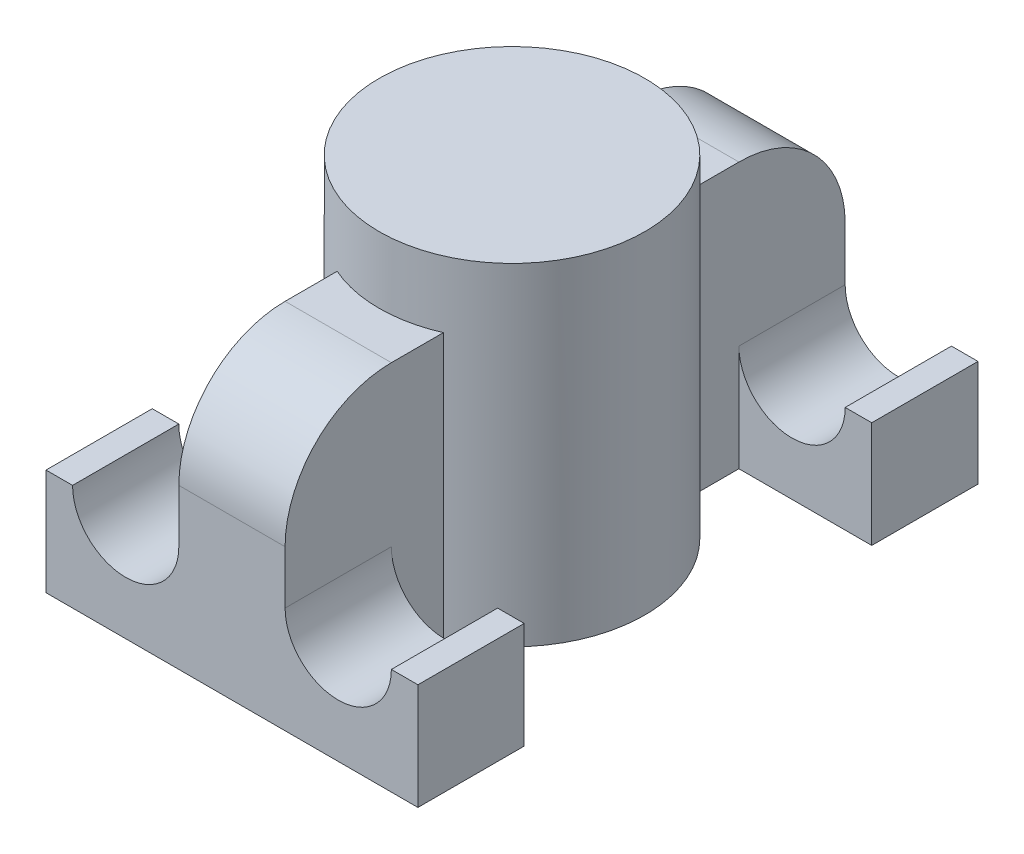
ISO-10303-21;
HEADER;
FILE_DESCRIPTION(('STEP AP214'),'2;1');
FILE_NAME('part.step','',(''),(''),'','','');
FILE_SCHEMA(('AUTOMOTIVE_DESIGN { 1 0 10303 214 1 1 1 1 }'));
ENDSEC;
DATA;
#1=APPLICATION_CONTEXT('core data for automotive mechanical design processes');
#2=APPLICATION_PROTOCOL_DEFINITION('international standard','automotive_design',2000,#1);
#3=PRODUCT_CONTEXT('',#1,'mechanical');
#4=PRODUCT('Part','Part','',(#3));
#5=PRODUCT_RELATED_PRODUCT_CATEGORY('part','',(#4));
#6=PRODUCT_DEFINITION_FORMATION('','',#4);
#7=PRODUCT_DEFINITION_CONTEXT('part definition',#1,'design');
#8=PRODUCT_DEFINITION('design','',#6,#7);
#9=PRODUCT_DEFINITION_SHAPE('','',#8);
#10=(LENGTH_UNIT() NAMED_UNIT(*) SI_UNIT(.MILLI.,.METRE.));
#11=(NAMED_UNIT(*) PLANE_ANGLE_UNIT() SI_UNIT($,.RADIAN.));
#12=(NAMED_UNIT(*) SI_UNIT($,.STERADIAN.) SOLID_ANGLE_UNIT());
#13=UNCERTAINTY_MEASURE_WITH_UNIT(LENGTH_MEASURE(1.E-05),#10,'distance_accuracy_value','');
#14=(GEOMETRIC_REPRESENTATION_CONTEXT(3) GLOBAL_UNCERTAINTY_ASSIGNED_CONTEXT((#13)) GLOBAL_UNIT_ASSIGNED_CONTEXT((#10,
#11,#12)) REPRESENTATION_CONTEXT('',''));
#15=CARTESIAN_POINT('',(0.,0.,0.));
#16=DIRECTION('',(0.,0.,1.));
#17=DIRECTION('',(1.,0.,0.));
#18=AXIS2_PLACEMENT_3D('',#15,#16,#17);
#19=CARTESIAN_POINT('',(-4.,20.,-21.0825756949558));
#20=DIRECTION('',(1.,0.,0.));
#21=DIRECTION('',(0.,0.,-1.));
#22=AXIS2_PLACEMENT_3D('',#19,#20,#21);
#23=PLANE('',#22);
#24=DIRECTION('',(0.,0.,1.));
#25=VECTOR('',#24,1.);
#26=CARTESIAN_POINT('',(-4.,20.,-21.0825756949558));
#27=LINE('',#26,#25);
#28=CARTESIAN_POINT('',(-4.,20.,-13.0825756949558));
#29=VERTEX_POINT('',#28);
#30=CARTESIAN_POINT('',(-4.,20.,-9.16515138991168));
#31=VERTEX_POINT('',#30);
#32=EDGE_CURVE('E381',#29,#31,#27,.T.);
#33=ORIENTED_EDGE('',*,*,#32,.F.);
#34=CARTESIAN_POINT('',(-4.,12.,-13.0825756949558));
#35=DIRECTION('',(1.,0.,0.));
#36=DIRECTION('',(0.,0.,-1.));
#37=AXIS2_PLACEMENT_3D('',#34,#35,#36);
#38=CIRCLE('',#37,8.);
#39=CARTESIAN_POINT('',(-4.,12.,-21.0825756949558));
#40=VERTEX_POINT('',#39);
#41=EDGE_CURVE('E404',#29,#40,#38,.F.);
#42=ORIENTED_EDGE('',*,*,#41,.T.);
#43=DIRECTION('',(0.,-1.,0.));
#44=VECTOR('',#43,1.);
#45=CARTESIAN_POINT('',(-4.,20.,-21.0825756949558));
#46=LINE('',#45,#44);
#47=CARTESIAN_POINT('',(-4.,8.,-21.0825756949558));
#48=VERTEX_POINT('',#47);
#49=EDGE_CURVE('E386',#40,#48,#46,.T.);
#50=ORIENTED_EDGE('',*,*,#49,.T.);
#51=DIRECTION('',(0.,0.,-1.));
#52=VECTOR('',#51,1.);
#53=CARTESIAN_POINT('',(-4.,8.,-13.0825756949558));
#54=LINE('',#53,#52);
#55=CARTESIAN_POINT('',(-4.,8.,-13.0825756949558));
#56=VERTEX_POINT('',#55);
#57=EDGE_CURVE('E228',#56,#48,#54,.T.);
#58=ORIENTED_EDGE('',*,*,#57,.F.);
#59=DIRECTION('',(0.,1.,0.));
#60=VECTOR('',#59,1.);
#61=CARTESIAN_POINT('',(-4.,8.,-13.0825756949558));
#62=LINE('',#61,#60);
#63=CARTESIAN_POINT('',(-4.,0.,-13.0825756949558));
#64=VERTEX_POINT('',#63);
#65=EDGE_CURVE('E225',#64,#56,#62,.T.);
#66=ORIENTED_EDGE('',*,*,#65,.F.);
#67=DIRECTION('',(0.,0.,1.));
#68=VECTOR('',#67,1.);
#69=CARTESIAN_POINT('',(-4.,0.,-21.0825756949558));
#70=LINE('',#69,#68);
#71=CARTESIAN_POINT('',(-4.,0.,-9.16515138991168));
#72=VERTEX_POINT('',#71);
#73=EDGE_CURVE('E209',#64,#72,#70,.T.);
#74=ORIENTED_EDGE('',*,*,#73,.T.);
#75=DIRECTION('',(0.,1.,0.));
#76=VECTOR('',#75,1.);
#77=CARTESIAN_POINT('',(-4.,0.,-9.16515138991168));
#78=LINE('',#77,#76);
#79=EDGE_CURVE('E379',#72,#31,#78,.T.);
#80=ORIENTED_EDGE('',*,*,#79,.T.);
#81=EDGE_LOOP('',(#33,#42,#50,#58,#66,#74,#80));
#82=FACE_BOUND('',#81,.T.);
#83=ADVANCED_FACE('F35',(#82),#23,.F.);
#84=CARTESIAN_POINT('',(4.,20.,-21.0825756949558));
#85=DIRECTION('',(-1.,0.,0.));
#86=DIRECTION('',(0.,0.,1.));
#87=AXIS2_PLACEMENT_3D('',#84,#85,#86);
#88=PLANE('',#87);
#89=DIRECTION('',(0.,-1.,0.));
#90=VECTOR('',#89,1.);
#91=CARTESIAN_POINT('',(4.,20.,-21.0825756949558));
#92=LINE('',#91,#90);
#93=CARTESIAN_POINT('',(4.,12.,-21.0825756949558));
#94=VERTEX_POINT('',#93);
#95=CARTESIAN_POINT('',(4.,8.,-21.0825756949558));
#96=VERTEX_POINT('',#95);
#97=EDGE_CURVE('E395',#94,#96,#92,.T.);
#98=ORIENTED_EDGE('',*,*,#97,.F.);
#99=CARTESIAN_POINT('',(4.,12.,-13.0825756949558));
#100=DIRECTION('',(-1.,0.,0.));
#101=DIRECTION('',(0.,0.,1.));
#102=AXIS2_PLACEMENT_3D('',#99,#100,#101);
#103=CIRCLE('',#102,8.);
#104=CARTESIAN_POINT('',(4.,20.,-13.0825756949558));
#105=VERTEX_POINT('',#104);
#106=EDGE_CURVE('E408',#94,#105,#103,.F.);
#107=ORIENTED_EDGE('',*,*,#106,.T.);
#108=DIRECTION('',(0.,0.,-1.));
#109=VECTOR('',#108,1.);
#110=CARTESIAN_POINT('',(4.,20.,-21.0825756949558));
#111=LINE('',#110,#109);
#112=CARTESIAN_POINT('',(4.,20.,-9.16515138991168));
#113=VERTEX_POINT('',#112);
#114=EDGE_CURVE('E383',#113,#105,#111,.T.);
#115=ORIENTED_EDGE('',*,*,#114,.F.);
#116=DIRECTION('',(0.,1.,0.));
#117=VECTOR('',#116,1.);
#118=CARTESIAN_POINT('',(4.,0.,-9.16515138991168));
#119=LINE('',#118,#117);
#120=CARTESIAN_POINT('',(4.,0.,-9.16515138991168));
#121=VERTEX_POINT('',#120);
#122=EDGE_CURVE('E377',#113,#121,#119,.F.);
#123=ORIENTED_EDGE('',*,*,#122,.T.);
#124=DIRECTION('',(0.,0.,-1.));
#125=VECTOR('',#124,1.);
#126=CARTESIAN_POINT('',(4.,0.,-21.0825756949558));
#127=LINE('',#126,#125);
#128=CARTESIAN_POINT('',(4.,0.,-13.0825756949558));
#129=VERTEX_POINT('',#128);
#130=EDGE_CURVE('E389',#121,#129,#127,.T.);
#131=ORIENTED_EDGE('',*,*,#130,.T.);
#132=DIRECTION('',(0.,1.,0.));
#133=VECTOR('',#132,1.);
#134=CARTESIAN_POINT('',(4.,8.,-13.0825756949558));
#135=LINE('',#134,#133);
#136=CARTESIAN_POINT('',(4.,8.,-13.0825756949558));
#137=VERTEX_POINT('',#136);
#138=EDGE_CURVE('E260',#129,#137,#135,.T.);
#139=ORIENTED_EDGE('',*,*,#138,.T.);
#140=DIRECTION('',(0.,0.,-1.));
#141=VECTOR('',#140,1.);
#142=CARTESIAN_POINT('',(4.,8.,-13.0825756949558));
#143=LINE('',#142,#141);
#144=EDGE_CURVE('E275',#137,#96,#143,.T.);
#145=ORIENTED_EDGE('',*,*,#144,.T.);
#146=EDGE_LOOP('',(#98,#107,#115,#123,#131,#139,#145));
#147=FACE_BOUND('',#146,.T.);
#148=ADVANCED_FACE('F436',(#147),#88,.F.);
#149=CARTESIAN_POINT('',(4.,20.,13.0825756949558));
#150=VERTEX_POINT('',#149);
#151=CARTESIAN_POINT('',(4.,20.,9.16515138991168));
#152=VERTEX_POINT('',#151);
#153=EDGE_CURVE('E385',#150,#152,#111,.T.);
#154=ORIENTED_EDGE('',*,*,#153,.F.);
#155=CARTESIAN_POINT('',(4.,12.,13.0825756949558));
#156=DIRECTION('',(-1.,0.,0.));
#157=DIRECTION('',(0.,0.,1.));
#158=AXIS2_PLACEMENT_3D('',#155,#156,#157);
#159=CIRCLE('',#158,8.);
#160=CARTESIAN_POINT('',(4.,12.,21.0825756949558));
#161=VERTEX_POINT('',#160);
#162=EDGE_CURVE('E57',#150,#161,#159,.F.);
#163=ORIENTED_EDGE('',*,*,#162,.T.);
#164=DIRECTION('',(0.,-1.,0.));
#165=VECTOR('',#164,1.);
#166=CARTESIAN_POINT('',(4.,20.,21.0825756949558));
#167=LINE('',#166,#165);
#168=CARTESIAN_POINT('',(4.,8.,21.0825756949558));
#169=VERTEX_POINT('',#168);
#170=EDGE_CURVE('E397',#161,#169,#167,.T.);
#171=ORIENTED_EDGE('',*,*,#170,.T.);
#172=DIRECTION('',(0.,0.,1.));
#173=VECTOR('',#172,1.);
#174=CARTESIAN_POINT('',(4.,8.,13.0825756949558));
#175=LINE('',#174,#173);
#176=CARTESIAN_POINT('',(4.,8.,13.0825756949558));
#177=VERTEX_POINT('',#176);
#178=EDGE_CURVE('E312',#177,#169,#175,.T.);
#179=ORIENTED_EDGE('',*,*,#178,.F.);
#180=DIRECTION('',(0.,1.,0.));
#181=VECTOR('',#180,1.);
#182=CARTESIAN_POINT('',(4.,8.,13.0825756949558));
#183=LINE('',#182,#181);
#184=CARTESIAN_POINT('',(4.,0.,13.0825756949558));
#185=VERTEX_POINT('',#184);
#186=EDGE_CURVE('E293',#185,#177,#183,.T.);
#187=ORIENTED_EDGE('',*,*,#186,.F.);
#188=CARTESIAN_POINT('',(4.,0.,9.16515138991168));
#189=VERTEX_POINT('',#188);
#190=EDGE_CURVE('E390',#185,#189,#127,.T.);
#191=ORIENTED_EDGE('',*,*,#190,.T.);
#192=DIRECTION('',(0.,1.,0.));
#193=VECTOR('',#192,1.);
#194=CARTESIAN_POINT('',(4.,0.,9.16515138991168));
#195=LINE('',#194,#193);
#196=EDGE_CURVE('E371',#189,#152,#195,.T.);
#197=ORIENTED_EDGE('',*,*,#196,.T.);
#198=EDGE_LOOP('',(#154,#163,#171,#179,#187,#191,#197));
#199=FACE_BOUND('',#198,.T.);
#200=ADVANCED_FACE('F420',(#199),#88,.F.);
#201=DIRECTION('',(0.,-1.,0.));
#202=VECTOR('',#201,1.);
#203=CARTESIAN_POINT('',(-4.,20.,21.0825756949558));
#204=LINE('',#203,#202);
#205=CARTESIAN_POINT('',(-4.,12.,21.0825756949558));
#206=VERTEX_POINT('',#205);
#207=CARTESIAN_POINT('',(-4.,8.,21.0825756949558));
#208=VERTEX_POINT('',#207);
#209=EDGE_CURVE('E399',#206,#208,#204,.T.);
#210=ORIENTED_EDGE('',*,*,#209,.F.);
#211=CARTESIAN_POINT('',(-4.,12.,13.0825756949558));
#212=DIRECTION('',(1.,0.,0.));
#213=DIRECTION('',(0.,0.,-1.));
#214=AXIS2_PLACEMENT_3D('',#211,#212,#213);
#215=CIRCLE('',#214,8.);
#216=CARTESIAN_POINT('',(-4.,20.,13.0825756949558));
#217=VERTEX_POINT('',#216);
#218=EDGE_CURVE('E11',#206,#217,#215,.F.);
#219=ORIENTED_EDGE('',*,*,#218,.T.);
#220=CARTESIAN_POINT('',(-4.,20.,9.16515138991168));
#221=VERTEX_POINT('',#220);
#222=EDGE_CURVE('E384',#221,#217,#27,.T.);
#223=ORIENTED_EDGE('',*,*,#222,.F.);
#224=DIRECTION('',(0.,1.,0.));
#225=VECTOR('',#224,1.);
#226=CARTESIAN_POINT('',(-4.,0.,9.16515138991168));
#227=LINE('',#226,#225);
#228=CARTESIAN_POINT('',(-4.,0.,9.16515138991168));
#229=VERTEX_POINT('',#228);
#230=EDGE_CURVE('E375',#221,#229,#227,.F.);
#231=ORIENTED_EDGE('',*,*,#230,.T.);
#232=CARTESIAN_POINT('',(-4.,0.,13.0825756949558));
#233=VERTEX_POINT('',#232);
#234=EDGE_CURVE('E222',#229,#233,#70,.T.);
#235=ORIENTED_EDGE('',*,*,#234,.T.);
#236=DIRECTION('',(0.,1.,0.));
#237=VECTOR('',#236,1.);
#238=CARTESIAN_POINT('',(-4.,8.,13.0825756949558));
#239=LINE('',#238,#237);
#240=CARTESIAN_POINT('',(-4.,8.,13.0825756949558));
#241=VERTEX_POINT('',#240);
#242=EDGE_CURVE('E324',#233,#241,#239,.T.);
#243=ORIENTED_EDGE('',*,*,#242,.T.);
#244=DIRECTION('',(0.,0.,1.));
#245=VECTOR('',#244,1.);
#246=CARTESIAN_POINT('',(-4.,8.,13.0825756949558));
#247=LINE('',#246,#245);
#248=EDGE_CURVE('E339',#241,#208,#247,.T.);
#249=ORIENTED_EDGE('',*,*,#248,.T.);
#250=EDGE_LOOP('',(#210,#219,#223,#231,#235,#243,#249));
#251=FACE_BOUND('',#250,.T.);
#252=ADVANCED_FACE('F428',(#251),#23,.F.);
#253=CARTESIAN_POINT('',(-4.,20.,21.0825756949558));
#254=DIRECTION('',(0.,1.,0.));
#255=DIRECTION('',(0.,0.,1.));
#256=AXIS2_PLACEMENT_3D('',#253,#254,#255);
#257=PLANE('',#256);
#258=ORIENTED_EDGE('',*,*,#114,.T.);
#259=DIRECTION('',(-1.,0.,0.));
#260=VECTOR('',#259,1.);
#261=CARTESIAN_POINT('',(-4.,20.,-13.0825756949558));
#262=LINE('',#261,#260);
#263=EDGE_CURVE('E401',#105,#29,#262,.T.);
#264=ORIENTED_EDGE('',*,*,#263,.T.);
#265=ORIENTED_EDGE('',*,*,#32,.T.);
#266=CARTESIAN_POINT('',(0.,20.,0.));
#267=DIRECTION('',(0.,1.,0.));
#268=DIRECTION('',(0.,0.,1.));
#269=AXIS2_PLACEMENT_3D('',#266,#267,#268);
#270=CIRCLE('',#269,10.);
#271=EDGE_CURVE('E372',#113,#31,#270,.T.);
#272=ORIENTED_EDGE('',*,*,#271,.F.);
#273=EDGE_LOOP('',(#258,#264,#265,#272));
#274=FACE_BOUND('',#273,.T.);
#275=ADVANCED_FACE('F445',(#274),#257,.T.);
#276=CARTESIAN_POINT('',(-4.,20.,21.0825756949558));
#277=DIRECTION('',(0.,0.,-1.));
#278=DIRECTION('',(-1.,0.,0.));
#279=AXIS2_PLACEMENT_3D('',#276,#277,#278);
#280=PLANE('',#279);
#281=ORIENTED_EDGE('',*,*,#170,.F.);
#282=DIRECTION('',(1.,0.,0.));
#283=VECTOR('',#282,1.);
#284=CARTESIAN_POINT('',(-4.,12.,21.0825756949558));
#285=LINE('',#284,#283);
#286=EDGE_CURVE('E43',#161,#206,#285,.F.);
#287=ORIENTED_EDGE('',*,*,#286,.T.);
#288=ORIENTED_EDGE('',*,*,#209,.T.);
#289=CARTESIAN_POINT('',(-8.,8.,21.0825756949558));
#290=DIRECTION('',(0.,0.,-1.));
#291=DIRECTION('',(1.,0.,0.));
#292=AXIS2_PLACEMENT_3D('',#289,#290,#291);
#293=CIRCLE('',#292,4.);
#294=CARTESIAN_POINT('',(-12.,8.,21.0825756949558));
#295=VERTEX_POINT('',#294);
#296=EDGE_CURVE('E315',#208,#295,#293,.T.);
#297=ORIENTED_EDGE('',*,*,#296,.T.);
#298=DIRECTION('',(-1.,0.,0.));
#299=VECTOR('',#298,1.);
#300=CARTESIAN_POINT('',(-14.,8.,21.0825756949558));
#301=LINE('',#300,#299);
#302=CARTESIAN_POINT('',(-14.,8.,21.0825756949558));
#303=VERTEX_POINT('',#302);
#304=EDGE_CURVE('E342',#295,#303,#301,.T.);
#305=ORIENTED_EDGE('',*,*,#304,.T.);
#306=DIRECTION('',(0.,-1.,0.));
#307=VECTOR('',#306,1.);
#308=CARTESIAN_POINT('',(-14.,0.,21.0825756949558));
#309=LINE('',#308,#307);
#310=CARTESIAN_POINT('',(-14.,0.,21.0825756949558));
#311=VERTEX_POINT('',#310);
#312=EDGE_CURVE('E327',#303,#311,#309,.T.);
#313=ORIENTED_EDGE('',*,*,#312,.T.);
#314=DIRECTION('',(1.,0.,0.));
#315=VECTOR('',#314,1.);
#316=CARTESIAN_POINT('',(-4.,0.,21.0825756949558));
#317=LINE('',#316,#315);
#318=CARTESIAN_POINT('',(14.,0.,21.0825756949558));
#319=VERTEX_POINT('',#318);
#320=EDGE_CURVE('E221',#311,#319,#317,.T.);
#321=ORIENTED_EDGE('',*,*,#320,.T.);
#322=DIRECTION('',(0.,-1.,0.));
#323=VECTOR('',#322,1.);
#324=CARTESIAN_POINT('',(14.,0.,21.0825756949558));
#325=LINE('',#324,#323);
#326=CARTESIAN_POINT('',(14.,8.,21.0825756949558));
#327=VERTEX_POINT('',#326);
#328=EDGE_CURVE('E286',#327,#319,#325,.T.);
#329=ORIENTED_EDGE('',*,*,#328,.F.);
#330=DIRECTION('',(1.,0.,0.));
#331=VECTOR('',#330,1.);
#332=CARTESIAN_POINT('',(14.,8.,21.0825756949558));
#333=LINE('',#332,#331);
#334=CARTESIAN_POINT('',(12.,8.,21.0825756949558));
#335=VERTEX_POINT('',#334);
#336=EDGE_CURVE('E309',#335,#327,#333,.T.);
#337=ORIENTED_EDGE('',*,*,#336,.F.);
#338=CARTESIAN_POINT('',(8.,8.,21.0825756949558));
#339=DIRECTION('',(0.,0.,1.));
#340=DIRECTION('',(-1.,0.,0.));
#341=AXIS2_PLACEMENT_3D('',#338,#339,#340);
#342=CIRCLE('',#341,4.);
#343=EDGE_CURVE('E297',#169,#335,#342,.T.);
#344=ORIENTED_EDGE('',*,*,#343,.F.);
#345=EDGE_LOOP('',(#281,#287,#288,#297,#305,#313,#321,#329,#337,#344));
#346=FACE_BOUND('',#345,.T.);
#347=ADVANCED_FACE('F450',(#346),#280,.F.);
#348=CARTESIAN_POINT('',(-4.,20.,-21.0825756949558));
#349=DIRECTION('',(0.,0.,1.));
#350=DIRECTION('',(1.,0.,0.));
#351=AXIS2_PLACEMENT_3D('',#348,#349,#350);
#352=PLANE('',#351);
#353=ORIENTED_EDGE('',*,*,#49,.F.);
#354=DIRECTION('',(-1.,0.,0.));
#355=VECTOR('',#354,1.);
#356=CARTESIAN_POINT('',(4.,12.,-21.0825756949558));
#357=LINE('',#356,#355);
#358=EDGE_CURVE('E406',#40,#94,#357,.F.);
#359=ORIENTED_EDGE('',*,*,#358,.T.);
#360=ORIENTED_EDGE('',*,*,#97,.T.);
#361=CARTESIAN_POINT('',(8.,8.,-21.0825756949558));
#362=DIRECTION('',(0.,0.,1.));
#363=DIRECTION('',(-1.,0.,0.));
#364=AXIS2_PLACEMENT_3D('',#361,#362,#363);
#365=CIRCLE('',#364,4.);
#366=CARTESIAN_POINT('',(12.,8.,-21.0825756949558));
#367=VERTEX_POINT('',#366);
#368=EDGE_CURVE('E252',#96,#367,#365,.T.);
#369=ORIENTED_EDGE('',*,*,#368,.T.);
#370=DIRECTION('',(1.,0.,0.));
#371=VECTOR('',#370,1.);
#372=CARTESIAN_POINT('',(14.,8.,-21.0825756949558));
#373=LINE('',#372,#371);
#374=CARTESIAN_POINT('',(14.,8.,-21.0825756949558));
#375=VERTEX_POINT('',#374);
#376=EDGE_CURVE('E278',#367,#375,#373,.T.);
#377=ORIENTED_EDGE('',*,*,#376,.T.);
#378=DIRECTION('',(0.,-1.,0.));
#379=VECTOR('',#378,1.);
#380=CARTESIAN_POINT('',(14.,0.,-21.0825756949558));
#381=LINE('',#380,#379);
#382=CARTESIAN_POINT('',(14.,0.,-21.0825756949558));
#383=VERTEX_POINT('',#382);
#384=EDGE_CURVE('E263',#375,#383,#381,.T.);
#385=ORIENTED_EDGE('',*,*,#384,.T.);
#386=DIRECTION('',(-1.,0.,0.));
#387=VECTOR('',#386,1.);
#388=CARTESIAN_POINT('',(-4.,0.,-21.0825756949558));
#389=LINE('',#388,#387);
#390=CARTESIAN_POINT('',(-14.,0.,-21.0825756949558));
#391=VERTEX_POINT('',#390);
#392=EDGE_CURVE('E392',#383,#391,#389,.T.);
#393=ORIENTED_EDGE('',*,*,#392,.T.);
#394=DIRECTION('',(0.,-1.,0.));
#395=VECTOR('',#394,1.);
#396=CARTESIAN_POINT('',(-14.,0.,-21.0825756949558));
#397=LINE('',#396,#395);
#398=CARTESIAN_POINT('',(-14.,8.,-21.0825756949558));
#399=VERTEX_POINT('',#398);
#400=EDGE_CURVE('E245',#399,#391,#397,.T.);
#401=ORIENTED_EDGE('',*,*,#400,.F.);
#402=DIRECTION('',(-1.,0.,0.));
#403=VECTOR('',#402,1.);
#404=CARTESIAN_POINT('',(-14.,8.,-21.0825756949558));
#405=LINE('',#404,#403);
#406=CARTESIAN_POINT('',(-12.,8.,-21.0825756949558));
#407=VERTEX_POINT('',#406);
#408=EDGE_CURVE('E248',#407,#399,#405,.T.);
#409=ORIENTED_EDGE('',*,*,#408,.F.);
#410=CARTESIAN_POINT('',(-8.,8.,-21.0825756949558));
#411=DIRECTION('',(0.,0.,-1.));
#412=DIRECTION('',(1.,0.,0.));
#413=AXIS2_PLACEMENT_3D('',#410,#411,#412);
#414=CIRCLE('',#413,4.);
#415=EDGE_CURVE('E231',#48,#407,#414,.T.);
#416=ORIENTED_EDGE('',*,*,#415,.F.);
#417=EDGE_LOOP('',(#353,#359,#360,#369,#377,#385,#393,#401,#409,#416));
#418=FACE_BOUND('',#417,.T.);
#419=ADVANCED_FACE('F456',(#418),#352,.F.);
#420=ORIENTED_EDGE('',*,*,#222,.T.);
#421=DIRECTION('',(1.,0.,0.));
#422=VECTOR('',#421,1.);
#423=CARTESIAN_POINT('',(4.,20.,13.0825756949558));
#424=LINE('',#423,#422);
#425=EDGE_CURVE('E410',#217,#150,#424,.T.);
#426=ORIENTED_EDGE('',*,*,#425,.T.);
#427=ORIENTED_EDGE('',*,*,#153,.T.);
#428=EDGE_CURVE('E368',#221,#152,#270,.T.);
#429=ORIENTED_EDGE('',*,*,#428,.F.);
#430=EDGE_LOOP('',(#420,#426,#427,#429));
#431=FACE_BOUND('',#430,.T.);
#432=ADVANCED_FACE('F416',(#431),#257,.T.);
#433=CARTESIAN_POINT('',(-4.,0.,21.0825756949558));
#434=DIRECTION('',(0.,1.,0.));
#435=DIRECTION('',(0.,0.,1.));
#436=AXIS2_PLACEMENT_3D('',#433,#434,#435);
#437=PLANE('',#436);
#438=CARTESIAN_POINT('',(0.,0.,0.));
#439=DIRECTION('',(0.,-1.,0.));
#440=DIRECTION('',(0.,0.,-1.));
#441=AXIS2_PLACEMENT_3D('',#438,#439,#440);
#442=CIRCLE('',#441,5.);
#443=CARTESIAN_POINT('',(0.,0.,-5.));
#444=VERTEX_POINT('',#443);
#445=EDGE_CURVE('E350',#444,#444,#442,.T.);
#446=ORIENTED_EDGE('',*,*,#445,.F.);
#447=EDGE_LOOP('',(#446));
#448=FACE_BOUND('',#447,.T.);
#449=ORIENTED_EDGE('',*,*,#234,.F.);
#450=CARTESIAN_POINT('',(0.,0.,0.));
#451=DIRECTION('',(0.,1.,0.));
#452=DIRECTION('',(0.,0.,1.));
#453=AXIS2_PLACEMENT_3D('',#450,#451,#452);
#454=CIRCLE('',#453,10.);
#455=EDGE_CURVE('E217',#72,#229,#454,.T.);
#456=ORIENTED_EDGE('',*,*,#455,.F.);
#457=ORIENTED_EDGE('',*,*,#73,.F.);
#458=DIRECTION('',(1.,0.,0.));
#459=VECTOR('',#458,1.);
#460=CARTESIAN_POINT('',(-4.,0.,-13.0825756949558));
#461=LINE('',#460,#459);
#462=CARTESIAN_POINT('',(-14.,0.,-13.0825756949558));
#463=VERTEX_POINT('',#462);
#464=EDGE_CURVE('E215',#463,#64,#461,.T.);
#465=ORIENTED_EDGE('',*,*,#464,.F.);
#466=DIRECTION('',(0.,0.,-1.));
#467=VECTOR('',#466,1.);
#468=CARTESIAN_POINT('',(-14.,0.,-13.0825756949558));
#469=LINE('',#468,#467);
#470=EDGE_CURVE('E244',#463,#391,#469,.T.);
#471=ORIENTED_EDGE('',*,*,#470,.T.);
#472=ORIENTED_EDGE('',*,*,#392,.F.);
#473=DIRECTION('',(0.,0.,-1.));
#474=VECTOR('',#473,1.);
#475=CARTESIAN_POINT('',(14.,0.,-13.0825756949558));
#476=LINE('',#475,#474);
#477=CARTESIAN_POINT('',(14.,0.,-13.0825756949558));
#478=VERTEX_POINT('',#477);
#479=EDGE_CURVE('E283',#478,#383,#476,.T.);
#480=ORIENTED_EDGE('',*,*,#479,.F.);
#481=DIRECTION('',(-1.,0.,0.));
#482=VECTOR('',#481,1.);
#483=CARTESIAN_POINT('',(4.,0.,-13.0825756949558));
#484=LINE('',#483,#482);
#485=EDGE_CURVE('E272',#478,#129,#484,.T.);
#486=ORIENTED_EDGE('',*,*,#485,.T.);
#487=ORIENTED_EDGE('',*,*,#130,.F.);
#488=EDGE_CURVE('E365',#189,#121,#454,.T.);
#489=ORIENTED_EDGE('',*,*,#488,.F.);
#490=ORIENTED_EDGE('',*,*,#190,.F.);
#491=DIRECTION('',(-1.,0.,0.));
#492=VECTOR('',#491,1.);
#493=CARTESIAN_POINT('',(4.,0.,13.0825756949558));
#494=LINE('',#493,#492);
#495=CARTESIAN_POINT('',(14.,0.,13.0825756949558));
#496=VERTEX_POINT('',#495);
#497=EDGE_CURVE('E296',#496,#185,#494,.T.);
#498=ORIENTED_EDGE('',*,*,#497,.F.);
#499=DIRECTION('',(0.,0.,1.));
#500=VECTOR('',#499,1.);
#501=CARTESIAN_POINT('',(14.,0.,13.0825756949558));
#502=LINE('',#501,#500);
#503=EDGE_CURVE('E306',#496,#319,#502,.T.);
#504=ORIENTED_EDGE('',*,*,#503,.T.);
#505=ORIENTED_EDGE('',*,*,#320,.F.);
#506=DIRECTION('',(0.,0.,1.));
#507=VECTOR('',#506,1.);
#508=CARTESIAN_POINT('',(-14.,0.,13.0825756949558));
#509=LINE('',#508,#507);
#510=CARTESIAN_POINT('',(-14.,0.,13.0825756949558));
#511=VERTEX_POINT('',#510);
#512=EDGE_CURVE('E347',#511,#311,#509,.T.);
#513=ORIENTED_EDGE('',*,*,#512,.F.);
#514=DIRECTION('',(1.,0.,0.));
#515=VECTOR('',#514,1.);
#516=CARTESIAN_POINT('',(-4.,0.,13.0825756949558));
#517=LINE('',#516,#515);
#518=EDGE_CURVE('E336',#511,#233,#517,.T.);
#519=ORIENTED_EDGE('',*,*,#518,.T.);
#520=EDGE_LOOP('',(#449,#456,#457,#465,#471,#472,#480,#486,#487,#489,#490,#498,#504,#505,#513,#519));
#521=FACE_BOUND('',#520,.T.);
#522=ADVANCED_FACE('F212',(#448,#521),#437,.F.);
#523=CARTESIAN_POINT('',(0.,0.,0.));
#524=DIRECTION('',(0.,1.,0.));
#525=DIRECTION('',(0.,0.,1.));
#526=AXIS2_PLACEMENT_3D('',#523,#524,#525);
#527=CYLINDRICAL_SURFACE('',#526,10.);
#528=CARTESIAN_POINT('',(0.,25.,0.));
#529=DIRECTION('',(0.,1.,0.));
#530=DIRECTION('',(0.,0.,1.));
#531=AXIS2_PLACEMENT_3D('',#528,#529,#530);
#532=CIRCLE('',#531,10.);
#533=CARTESIAN_POINT('',(0.,25.,10.));
#534=VERTEX_POINT('',#533);
#535=EDGE_CURVE('E362',#534,#534,#532,.T.);
#536=ORIENTED_EDGE('',*,*,#535,.F.);
#537=EDGE_LOOP('',(#536));
#538=FACE_BOUND('',#537,.T.);
#539=ORIENTED_EDGE('',*,*,#79,.F.);
#540=ORIENTED_EDGE('',*,*,#455,.T.);
#541=ORIENTED_EDGE('',*,*,#230,.F.);
#542=ORIENTED_EDGE('',*,*,#428,.T.);
#543=ORIENTED_EDGE('',*,*,#196,.F.);
#544=ORIENTED_EDGE('',*,*,#488,.T.);
#545=ORIENTED_EDGE('',*,*,#122,.F.);
#546=ORIENTED_EDGE('',*,*,#271,.T.);
#547=EDGE_LOOP('',(#539,#540,#541,#542,#543,#544,#545,#546));
#548=FACE_BOUND('',#547,.T.);
#549=ADVANCED_FACE('F426',(#538,#548),#527,.T.);
#550=CARTESIAN_POINT('',(0.,25.,0.));
#551=DIRECTION('',(0.,1.,0.));
#552=DIRECTION('',(0.,0.,1.));
#553=AXIS2_PLACEMENT_3D('',#550,#551,#552);
#554=PLANE('',#553);
#555=ORIENTED_EDGE('',*,*,#535,.T.);
#556=EDGE_LOOP('',(#555));
#557=FACE_BOUND('',#556,.T.);
#558=ADVANCED_FACE('F559',(#557),#554,.T.);
#559=CARTESIAN_POINT('',(0.,15.,0.));
#560=DIRECTION('',(0.,-1.,0.));
#561=DIRECTION('',(0.,0.,-1.));
#562=AXIS2_PLACEMENT_3D('',#559,#560,#561);
#563=CONICAL_SURFACE('',#562,5.,0.78539816339745);
#564=CARTESIAN_POINT('',(0.,20.,0.));
#565=VERTEX_POINT('',#564);
#566=VERTEX_LOOP('',#565);
#567=FACE_BOUND('',#566,.T.);
#568=CARTESIAN_POINT('',(0.,15.,0.));
#569=DIRECTION('',(0.,-1.,0.));
#570=DIRECTION('',(0.,0.,-1.));
#571=AXIS2_PLACEMENT_3D('',#568,#569,#570);
#572=CIRCLE('',#571,5.);
#573=CARTESIAN_POINT('',(0.,15.,-5.));
#574=VERTEX_POINT('',#573);
#575=EDGE_CURVE('E359',#574,#574,#572,.T.);
#576=ORIENTED_EDGE('',*,*,#575,.T.);
#577=EDGE_LOOP('',(#576));
#578=FACE_BOUND('',#577,.T.);
#579=ADVANCED_FACE('F555',(#567,#578),#563,.F.);
#580=CARTESIAN_POINT('',(0.,0.,0.));
#581=DIRECTION('',(0.,-1.,0.));
#582=DIRECTION('',(0.,0.,-1.));
#583=AXIS2_PLACEMENT_3D('',#580,#581,#582);
#584=CYLINDRICAL_SURFACE('',#583,5.);
#585=ORIENTED_EDGE('',*,*,#575,.F.);
#586=EDGE_LOOP('',(#585));
#587=FACE_BOUND('',#586,.T.);
#588=ORIENTED_EDGE('',*,*,#445,.T.);
#589=EDGE_LOOP('',(#588));
#590=FACE_BOUND('',#589,.T.);
#591=ADVANCED_FACE('F545',(#587,#590),#584,.F.);
#592=CARTESIAN_POINT('',(-14.,0.,13.0825756949558));
#593=DIRECTION('',(-1.,0.,0.));
#594=DIRECTION('',(0.,0.,1.));
#595=AXIS2_PLACEMENT_3D('',#592,#593,#594);
#596=PLANE('',#595);
#597=ORIENTED_EDGE('',*,*,#312,.F.);
#598=DIRECTION('',(0.,0.,1.));
#599=VECTOR('',#598,1.);
#600=CARTESIAN_POINT('',(-14.,8.,13.0825756949558));
#601=LINE('',#600,#599);
#602=CARTESIAN_POINT('',(-14.,8.,13.0825756949558));
#603=VERTEX_POINT('',#602);
#604=EDGE_CURVE('E351',#603,#303,#601,.T.);
#605=ORIENTED_EDGE('',*,*,#604,.F.);
#606=DIRECTION('',(0.,-1.,0.));
#607=VECTOR('',#606,1.);
#608=CARTESIAN_POINT('',(-14.,0.,13.0825756949558));
#609=LINE('',#608,#607);
#610=EDGE_CURVE('E333',#603,#511,#609,.T.);
#611=ORIENTED_EDGE('',*,*,#610,.T.);
#612=ORIENTED_EDGE('',*,*,#512,.T.);
#613=EDGE_LOOP('',(#597,#605,#611,#612));
#614=FACE_BOUND('',#613,.T.);
#615=ADVANCED_FACE('F541',(#614),#596,.T.);
#616=CARTESIAN_POINT('',(-14.,8.,13.0825756949558));
#617=DIRECTION('',(0.,1.,0.));
#618=DIRECTION('',(-1.,0.,0.));
#619=AXIS2_PLACEMENT_3D('',#616,#617,#618);
#620=PLANE('',#619);
#621=ORIENTED_EDGE('',*,*,#304,.F.);
#622=DIRECTION('',(0.,0.,1.));
#623=VECTOR('',#622,1.);
#624=CARTESIAN_POINT('',(-12.,8.,13.0825756949558));
#625=LINE('',#624,#623);
#626=CARTESIAN_POINT('',(-12.,8.,13.0825756949558));
#627=VERTEX_POINT('',#626);
#628=EDGE_CURVE('E353',#627,#295,#625,.T.);
#629=ORIENTED_EDGE('',*,*,#628,.F.);
#630=DIRECTION('',(-1.,0.,0.));
#631=VECTOR('',#630,1.);
#632=CARTESIAN_POINT('',(-14.,8.,13.0825756949558));
#633=LINE('',#632,#631);
#634=EDGE_CURVE('E330',#627,#603,#633,.T.);
#635=ORIENTED_EDGE('',*,*,#634,.T.);
#636=ORIENTED_EDGE('',*,*,#604,.T.);
#637=EDGE_LOOP('',(#621,#629,#635,#636));
#638=FACE_BOUND('',#637,.T.);
#639=ADVANCED_FACE('F544',(#638),#620,.T.);
#640=CARTESIAN_POINT('',(-8.,8.,13.0825756949558));
#641=DIRECTION('',(0.,0.,1.));
#642=DIRECTION('',(1.,0.,0.));
#643=AXIS2_PLACEMENT_3D('',#640,#641,#642);
#644=CYLINDRICAL_SURFACE('',#643,4.);
#645=ORIENTED_EDGE('',*,*,#296,.F.);
#646=ORIENTED_EDGE('',*,*,#248,.F.);
#647=CARTESIAN_POINT('',(-8.,8.,13.0825756949558));
#648=DIRECTION('',(0.,0.,-1.));
#649=DIRECTION('',(1.,0.,0.));
#650=AXIS2_PLACEMENT_3D('',#647,#648,#649);
#651=CIRCLE('',#650,4.);
#652=EDGE_CURVE('E326',#241,#627,#651,.T.);
#653=ORIENTED_EDGE('',*,*,#652,.T.);
#654=ORIENTED_EDGE('',*,*,#628,.T.);
#655=EDGE_LOOP('',(#645,#646,#653,#654));
#656=FACE_BOUND('',#655,.T.);
#657=ADVANCED_FACE('F539',(#656),#644,.F.);
#658=CARTESIAN_POINT('',(-8.,8.,13.0825756949558));
#659=DIRECTION('',(0.,0.,1.));
#660=DIRECTION('',(1.,0.,0.));
#661=AXIS2_PLACEMENT_3D('',#658,#659,#660);
#662=PLANE('',#661);
#663=ORIENTED_EDGE('',*,*,#242,.F.);
#664=ORIENTED_EDGE('',*,*,#518,.F.);
#665=ORIENTED_EDGE('',*,*,#610,.F.);
#666=ORIENTED_EDGE('',*,*,#634,.F.);
#667=ORIENTED_EDGE('',*,*,#652,.F.);
#668=EDGE_LOOP('',(#663,#664,#665,#666,#667));
#669=FACE_BOUND('',#668,.T.);
#670=ADVANCED_FACE('F530',(#669),#662,.F.);
#671=CARTESIAN_POINT('',(8.,8.,13.0825756949558));
#672=DIRECTION('',(0.,0.,1.));
#673=DIRECTION('',(1.,0.,0.));
#674=AXIS2_PLACEMENT_3D('',#671,#672,#673);
#675=CYLINDRICAL_SURFACE('',#674,4.);
#676=ORIENTED_EDGE('',*,*,#343,.T.);
#677=DIRECTION('',(0.,0.,1.));
#678=VECTOR('',#677,1.);
#679=CARTESIAN_POINT('',(12.,8.,13.0825756949558));
#680=LINE('',#679,#678);
#681=CARTESIAN_POINT('',(12.,8.,13.0825756949558));
#682=VERTEX_POINT('',#681);
#683=EDGE_CURVE('E316',#682,#335,#680,.T.);
#684=ORIENTED_EDGE('',*,*,#683,.F.);
#685=CARTESIAN_POINT('',(8.,8.,13.0825756949558));
#686=DIRECTION('',(0.,0.,1.));
#687=DIRECTION('',(-1.,0.,0.));
#688=AXIS2_PLACEMENT_3D('',#685,#686,#687);
#689=CIRCLE('',#688,4.);
#690=EDGE_CURVE('E304',#177,#682,#689,.T.);
#691=ORIENTED_EDGE('',*,*,#690,.F.);
#692=ORIENTED_EDGE('',*,*,#178,.T.);
#693=EDGE_LOOP('',(#676,#684,#691,#692));
#694=FACE_BOUND('',#693,.T.);
#695=ADVANCED_FACE('F468',(#694),#675,.F.);
#696=CARTESIAN_POINT('',(14.,8.,13.0825756949558));
#697=DIRECTION('',(0.,-1.,0.));
#698=DIRECTION('',(1.,0.,0.));
#699=AXIS2_PLACEMENT_3D('',#696,#697,#698);
#700=PLANE('',#699);
#701=ORIENTED_EDGE('',*,*,#336,.T.);
#702=DIRECTION('',(0.,0.,1.));
#703=VECTOR('',#702,1.);
#704=CARTESIAN_POINT('',(14.,8.,13.0825756949558));
#705=LINE('',#704,#703);
#706=CARTESIAN_POINT('',(14.,8.,13.0825756949558));
#707=VERTEX_POINT('',#706);
#708=EDGE_CURVE('E319',#707,#327,#705,.T.);
#709=ORIENTED_EDGE('',*,*,#708,.F.);
#710=DIRECTION('',(1.,0.,0.));
#711=VECTOR('',#710,1.);
#712=CARTESIAN_POINT('',(14.,8.,13.0825756949558));
#713=LINE('',#712,#711);
#714=EDGE_CURVE('E302',#682,#707,#713,.T.);
#715=ORIENTED_EDGE('',*,*,#714,.F.);
#716=ORIENTED_EDGE('',*,*,#683,.T.);
#717=EDGE_LOOP('',(#701,#709,#715,#716));
#718=FACE_BOUND('',#717,.T.);
#719=ADVANCED_FACE('F529',(#718),#700,.F.);
#720=CARTESIAN_POINT('',(14.,0.,13.0825756949558));
#721=DIRECTION('',(-1.,0.,0.));
#722=DIRECTION('',(0.,0.,1.));
#723=AXIS2_PLACEMENT_3D('',#720,#721,#722);
#724=PLANE('',#723);
#725=ORIENTED_EDGE('',*,*,#328,.T.);
#726=ORIENTED_EDGE('',*,*,#503,.F.);
#727=DIRECTION('',(0.,-1.,0.));
#728=VECTOR('',#727,1.);
#729=CARTESIAN_POINT('',(14.,0.,13.0825756949558));
#730=LINE('',#729,#728);
#731=EDGE_CURVE('E300',#707,#496,#730,.T.);
#732=ORIENTED_EDGE('',*,*,#731,.F.);
#733=ORIENTED_EDGE('',*,*,#708,.T.);
#734=EDGE_LOOP('',(#725,#726,#732,#733));
#735=FACE_BOUND('',#734,.T.);
#736=ADVANCED_FACE('F526',(#735),#724,.F.);
#737=CARTESIAN_POINT('',(8.,8.,13.0825756949558));
#738=DIRECTION('',(0.,0.,1.));
#739=DIRECTION('',(-1.,0.,0.));
#740=AXIS2_PLACEMENT_3D('',#737,#738,#739);
#741=PLANE('',#740);
#742=ORIENTED_EDGE('',*,*,#186,.T.);
#743=ORIENTED_EDGE('',*,*,#690,.T.);
#744=ORIENTED_EDGE('',*,*,#714,.T.);
#745=ORIENTED_EDGE('',*,*,#731,.T.);
#746=ORIENTED_EDGE('',*,*,#497,.T.);
#747=EDGE_LOOP('',(#742,#743,#744,#745,#746));
#748=FACE_BOUND('',#747,.T.);
#749=ADVANCED_FACE('F471',(#748),#741,.F.);
#750=CARTESIAN_POINT('',(14.,0.,-13.0825756949558));
#751=DIRECTION('',(1.,0.,0.));
#752=DIRECTION('',(0.,0.,-1.));
#753=AXIS2_PLACEMENT_3D('',#750,#751,#752);
#754=PLANE('',#753);
#755=ORIENTED_EDGE('',*,*,#384,.F.);
#756=DIRECTION('',(0.,0.,-1.));
#757=VECTOR('',#756,1.);
#758=CARTESIAN_POINT('',(14.,8.,-13.0825756949558));
#759=LINE('',#758,#757);
#760=CARTESIAN_POINT('',(14.,8.,-13.0825756949558));
#761=VERTEX_POINT('',#760);
#762=EDGE_CURVE('E287',#761,#375,#759,.T.);
#763=ORIENTED_EDGE('',*,*,#762,.F.);
#764=DIRECTION('',(0.,-1.,0.));
#765=VECTOR('',#764,1.);
#766=CARTESIAN_POINT('',(14.,0.,-13.0825756949558));
#767=LINE('',#766,#765);
#768=EDGE_CURVE('E269',#761,#478,#767,.T.);
#769=ORIENTED_EDGE('',*,*,#768,.T.);
#770=ORIENTED_EDGE('',*,*,#479,.T.);
#771=EDGE_LOOP('',(#755,#763,#769,#770));
#772=FACE_BOUND('',#771,.T.);
#773=ADVANCED_FACE('F500',(#772),#754,.T.);
#774=CARTESIAN_POINT('',(14.,8.,-13.0825756949558));
#775=DIRECTION('',(0.,1.,0.));
#776=DIRECTION('',(-1.,0.,0.));
#777=AXIS2_PLACEMENT_3D('',#774,#775,#776);
#778=PLANE('',#777);
#779=ORIENTED_EDGE('',*,*,#376,.F.);
#780=DIRECTION('',(0.,0.,-1.));
#781=VECTOR('',#780,1.);
#782=CARTESIAN_POINT('',(12.,8.,-13.0825756949558));
#783=LINE('',#782,#781);
#784=CARTESIAN_POINT('',(12.,8.,-13.0825756949558));
#785=VERTEX_POINT('',#784);
#786=EDGE_CURVE('E289',#785,#367,#783,.T.);
#787=ORIENTED_EDGE('',*,*,#786,.F.);
#788=DIRECTION('',(1.,0.,0.));
#789=VECTOR('',#788,1.);
#790=CARTESIAN_POINT('',(14.,8.,-13.0825756949558));
#791=LINE('',#790,#789);
#792=EDGE_CURVE('E266',#785,#761,#791,.T.);
#793=ORIENTED_EDGE('',*,*,#792,.T.);
#794=ORIENTED_EDGE('',*,*,#762,.T.);
#795=EDGE_LOOP('',(#779,#787,#793,#794));
#796=FACE_BOUND('',#795,.T.);
#797=ADVANCED_FACE('F506',(#796),#778,.T.);
#798=CARTESIAN_POINT('',(8.,8.,-13.0825756949558));
#799=DIRECTION('',(0.,0.,-1.));
#800=DIRECTION('',(-1.,0.,0.));
#801=AXIS2_PLACEMENT_3D('',#798,#799,#800);
#802=CYLINDRICAL_SURFACE('',#801,4.);
#803=ORIENTED_EDGE('',*,*,#368,.F.);
#804=ORIENTED_EDGE('',*,*,#144,.F.);
#805=CARTESIAN_POINT('',(8.,8.,-13.0825756949558));
#806=DIRECTION('',(0.,0.,1.));
#807=DIRECTION('',(-1.,0.,0.));
#808=AXIS2_PLACEMENT_3D('',#805,#806,#807);
#809=CIRCLE('',#808,4.);
#810=EDGE_CURVE('E262',#137,#785,#809,.T.);
#811=ORIENTED_EDGE('',*,*,#810,.T.);
#812=ORIENTED_EDGE('',*,*,#786,.T.);
#813=EDGE_LOOP('',(#803,#804,#811,#812));
#814=FACE_BOUND('',#813,.T.);
#815=ADVANCED_FACE('F513',(#814),#802,.F.);
#816=CARTESIAN_POINT('',(8.,8.,-13.0825756949558));
#817=DIRECTION('',(0.,0.,-1.));
#818=DIRECTION('',(-1.,0.,0.));
#819=AXIS2_PLACEMENT_3D('',#816,#817,#818);
#820=PLANE('',#819);
#821=ORIENTED_EDGE('',*,*,#138,.F.);
#822=ORIENTED_EDGE('',*,*,#485,.F.);
#823=ORIENTED_EDGE('',*,*,#768,.F.);
#824=ORIENTED_EDGE('',*,*,#792,.F.);
#825=ORIENTED_EDGE('',*,*,#810,.F.);
#826=EDGE_LOOP('',(#821,#822,#823,#824,#825));
#827=FACE_BOUND('',#826,.T.);
#828=ADVANCED_FACE('F509',(#827),#820,.F.);
#829=CARTESIAN_POINT('',(-8.,8.,-13.0825756949558));
#830=DIRECTION('',(0.,0.,-1.));
#831=DIRECTION('',(-1.,0.,0.));
#832=AXIS2_PLACEMENT_3D('',#829,#830,#831);
#833=CYLINDRICAL_SURFACE('',#832,4.);
#834=ORIENTED_EDGE('',*,*,#415,.T.);
#835=DIRECTION('',(0.,0.,-1.));
#836=VECTOR('',#835,1.);
#837=CARTESIAN_POINT('',(-12.,8.,-13.0825756949558));
#838=LINE('',#837,#836);
#839=CARTESIAN_POINT('',(-12.,8.,-13.0825756949558));
#840=VERTEX_POINT('',#839);
#841=EDGE_CURVE('E253',#840,#407,#838,.T.);
#842=ORIENTED_EDGE('',*,*,#841,.F.);
#843=CARTESIAN_POINT('',(-8.,8.,-13.0825756949558));
#844=DIRECTION('',(0.,0.,-1.));
#845=DIRECTION('',(1.,0.,0.));
#846=AXIS2_PLACEMENT_3D('',#843,#844,#845);
#847=CIRCLE('',#846,4.);
#848=EDGE_CURVE('E242',#56,#840,#847,.T.);
#849=ORIENTED_EDGE('',*,*,#848,.F.);
#850=ORIENTED_EDGE('',*,*,#57,.T.);
#851=EDGE_LOOP('',(#834,#842,#849,#850));
#852=FACE_BOUND('',#851,.T.);
#853=ADVANCED_FACE('F491',(#852),#833,.F.);
#854=CARTESIAN_POINT('',(-14.,8.,-13.0825756949558));
#855=DIRECTION('',(0.,-1.,0.));
#856=DIRECTION('',(1.,0.,0.));
#857=AXIS2_PLACEMENT_3D('',#854,#855,#856);
#858=PLANE('',#857);
#859=ORIENTED_EDGE('',*,*,#408,.T.);
#860=DIRECTION('',(0.,0.,-1.));
#861=VECTOR('',#860,1.);
#862=CARTESIAN_POINT('',(-14.,8.,-13.0825756949558));
#863=LINE('',#862,#861);
#864=CARTESIAN_POINT('',(-14.,8.,-13.0825756949558));
#865=VERTEX_POINT('',#864);
#866=EDGE_CURVE('E256',#865,#399,#863,.T.);
#867=ORIENTED_EDGE('',*,*,#866,.F.);
#868=DIRECTION('',(-1.,0.,0.));
#869=VECTOR('',#868,1.);
#870=CARTESIAN_POINT('',(-14.,8.,-13.0825756949558));
#871=LINE('',#870,#869);
#872=EDGE_CURVE('E238',#840,#865,#871,.T.);
#873=ORIENTED_EDGE('',*,*,#872,.F.);
#874=ORIENTED_EDGE('',*,*,#841,.T.);
#875=EDGE_LOOP('',(#859,#867,#873,#874));
#876=FACE_BOUND('',#875,.T.);
#877=ADVANCED_FACE('F495',(#876),#858,.F.);
#878=CARTESIAN_POINT('',(-14.,0.,-13.0825756949558));
#879=DIRECTION('',(1.,0.,0.));
#880=DIRECTION('',(0.,0.,-1.));
#881=AXIS2_PLACEMENT_3D('',#878,#879,#880);
#882=PLANE('',#881);
#883=ORIENTED_EDGE('',*,*,#400,.T.);
#884=ORIENTED_EDGE('',*,*,#470,.F.);
#885=DIRECTION('',(0.,-1.,0.));
#886=VECTOR('',#885,1.);
#887=CARTESIAN_POINT('',(-14.,0.,-13.0825756949558));
#888=LINE('',#887,#886);
#889=EDGE_CURVE('E235',#865,#463,#888,.T.);
#890=ORIENTED_EDGE('',*,*,#889,.F.);
#891=ORIENTED_EDGE('',*,*,#866,.T.);
#892=EDGE_LOOP('',(#883,#884,#890,#891));
#893=FACE_BOUND('',#892,.T.);
#894=ADVANCED_FACE('F497',(#893),#882,.F.);
#895=CARTESIAN_POINT('',(-8.,8.,-13.0825756949558));
#896=DIRECTION('',(0.,0.,-1.));
#897=DIRECTION('',(1.,0.,0.));
#898=AXIS2_PLACEMENT_3D('',#895,#896,#897);
#899=PLANE('',#898);
#900=ORIENTED_EDGE('',*,*,#65,.T.);
#901=ORIENTED_EDGE('',*,*,#848,.T.);
#902=ORIENTED_EDGE('',*,*,#872,.T.);
#903=ORIENTED_EDGE('',*,*,#889,.T.);
#904=ORIENTED_EDGE('',*,*,#464,.T.);
#905=EDGE_LOOP('',(#900,#901,#902,#903,#904));
#906=FACE_BOUND('',#905,.T.);
#907=ADVANCED_FACE('F233',(#906),#899,.F.);
#908=CARTESIAN_POINT('',(-4.,12.,-13.0825756949558));
#909=DIRECTION('',(1.,0.,0.));
#910=DIRECTION('',(0.,0.,-1.));
#911=AXIS2_PLACEMENT_3D('',#908,#909,#910);
#912=CYLINDRICAL_SURFACE('',#911,8.);
#913=ORIENTED_EDGE('',*,*,#106,.F.);
#914=ORIENTED_EDGE('',*,*,#358,.F.);
#915=ORIENTED_EDGE('',*,*,#41,.F.);
#916=ORIENTED_EDGE('',*,*,#263,.F.);
#917=EDGE_LOOP('',(#913,#914,#915,#916));
#918=FACE_BOUND('',#917,.T.);
#919=ADVANCED_FACE('F430',(#918),#912,.T.);
#920=CARTESIAN_POINT('',(-4.,12.,13.0825756949558));
#921=DIRECTION('',(-1.,0.,0.));
#922=DIRECTION('',(0.,0.,1.));
#923=AXIS2_PLACEMENT_3D('',#920,#921,#922);
#924=CYLINDRICAL_SURFACE('',#923,8.);
#925=ORIENTED_EDGE('',*,*,#218,.F.);
#926=ORIENTED_EDGE('',*,*,#286,.F.);
#927=ORIENTED_EDGE('',*,*,#162,.F.);
#928=ORIENTED_EDGE('',*,*,#425,.F.);
#929=EDGE_LOOP('',(#925,#926,#927,#928));
#930=FACE_BOUND('',#929,.T.);
#931=ADVANCED_FACE('F37',(#930),#924,.T.);
#932=CLOSED_SHELL('',(#83,#148,#200,#252,#275,#347,#419,#432,#522,#549,#558,#579,#591,#615,#639,
#657,#670,#695,#719,#736,#749,#773,#797,#815,#828,#853,#877,#894,#907,#919,#931));
#933=MANIFOLD_SOLID_BREP('B2',#932);
#934=ADVANCED_BREP_SHAPE_REPRESENTATION('',(#18,#933),#14);
#935=SHAPE_DEFINITION_REPRESENTATION(#9,#934);
ENDSEC;
END-ISO-10303-21;
